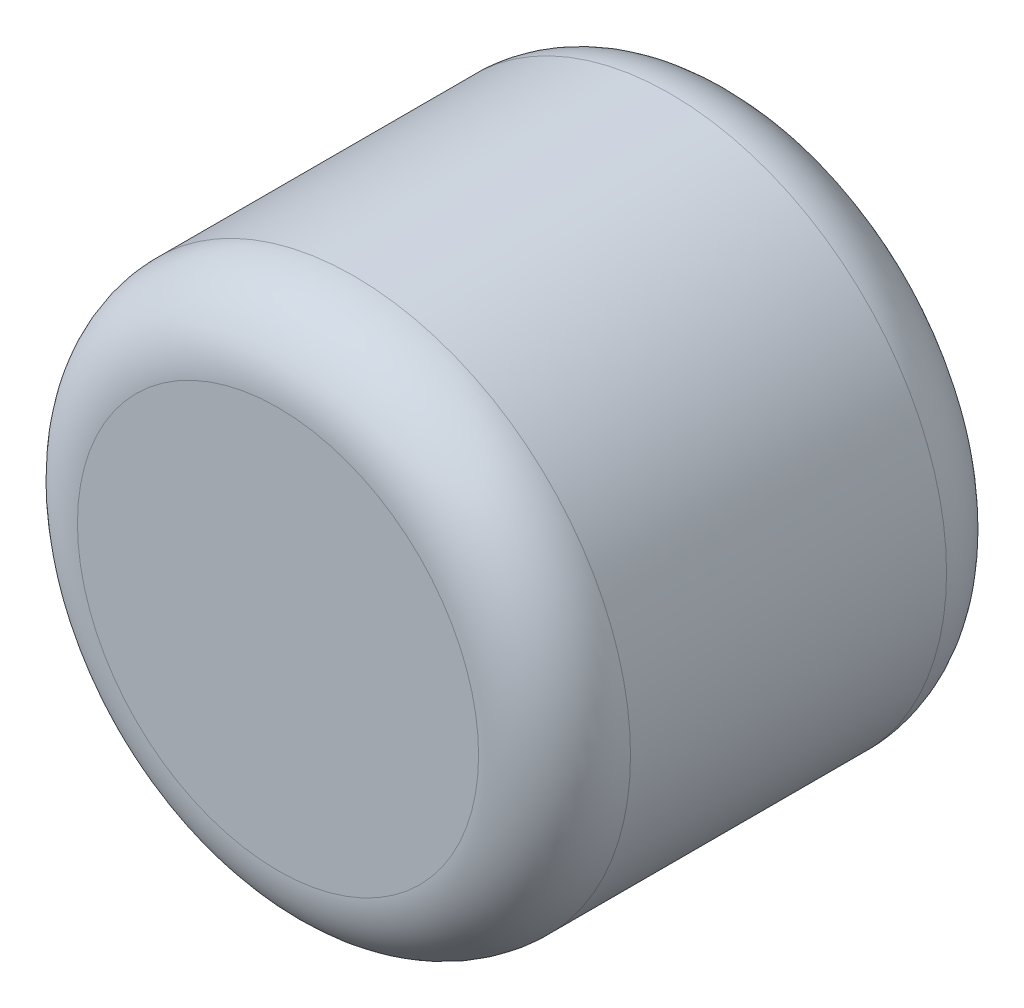
ISO-10303-21;
HEADER;
FILE_DESCRIPTION(('STEP AP214'),'2;1');
FILE_NAME('part.step','',(''),(''),'','','');
FILE_SCHEMA(('AUTOMOTIVE_DESIGN { 1 0 10303 214 1 1 1 1 }'));
ENDSEC;
DATA;
#1=APPLICATION_CONTEXT('core data for automotive mechanical design processes');
#2=APPLICATION_PROTOCOL_DEFINITION('international standard','automotive_design',2000,#1);
#3=PRODUCT_CONTEXT('',#1,'mechanical');
#4=PRODUCT('Part','Part','',(#3));
#5=PRODUCT_RELATED_PRODUCT_CATEGORY('part','',(#4));
#6=PRODUCT_DEFINITION_FORMATION('','',#4);
#7=PRODUCT_DEFINITION_CONTEXT('part definition',#1,'design');
#8=PRODUCT_DEFINITION('design','',#6,#7);
#9=PRODUCT_DEFINITION_SHAPE('','',#8);
#10=(LENGTH_UNIT() NAMED_UNIT(*) SI_UNIT(.MILLI.,.METRE.));
#11=(NAMED_UNIT(*) PLANE_ANGLE_UNIT() SI_UNIT($,.RADIAN.));
#12=(NAMED_UNIT(*) SI_UNIT($,.STERADIAN.) SOLID_ANGLE_UNIT());
#13=UNCERTAINTY_MEASURE_WITH_UNIT(LENGTH_MEASURE(1.E-05),#10,'distance_accuracy_value','');
#14=(GEOMETRIC_REPRESENTATION_CONTEXT(3) GLOBAL_UNCERTAINTY_ASSIGNED_CONTEXT((#13)) GLOBAL_UNIT_ASSIGNED_CONTEXT((#10,
#11,#12)) REPRESENTATION_CONTEXT('',''));
#15=CARTESIAN_POINT('',(0.,0.,0.));
#16=DIRECTION('',(0.,0.,1.));
#17=DIRECTION('',(1.,0.,0.));
#18=AXIS2_PLACEMENT_3D('',#15,#16,#17);
#19=CARTESIAN_POINT('',(0.,0.,7.8232));
#20=DIRECTION('',(0.,0.,-1.));
#21=DIRECTION('',(-1.,0.,0.));
#22=AXIS2_PLACEMENT_3D('',#19,#20,#21);
#23=CYLINDRICAL_SURFACE('',#22,4.6228);
#24=CARTESIAN_POINT('',(0.,0.,1.27));
#25=DIRECTION('',(0.,0.,1.));
#26=DIRECTION('',(1.,0.,0.));
#27=AXIS2_PLACEMENT_3D('',#24,#25,#26);
#28=CIRCLE('',#27,4.6228);
#29=CARTESIAN_POINT('',(4.6228,0.,1.27));
#30=VERTEX_POINT('',#29);
#31=EDGE_CURVE('E58',#30,#30,#28,.T.);
#32=ORIENTED_EDGE('',*,*,#31,.T.);
#33=EDGE_LOOP('',(#32));
#34=FACE_BOUND('',#33,.T.);
#35=CARTESIAN_POINT('',(0.,0.,6.5532));
#36=DIRECTION('',(0.,0.,1.));
#37=DIRECTION('',(1.,0.,0.));
#38=AXIS2_PLACEMENT_3D('',#35,#36,#37);
#39=CIRCLE('',#38,4.6228);
#40=CARTESIAN_POINT('',(4.6228,0.,6.5532));
#41=VERTEX_POINT('',#40);
#42=EDGE_CURVE('E63',#41,#41,#39,.F.);
#43=ORIENTED_EDGE('',*,*,#42,.T.);
#44=EDGE_LOOP('',(#43));
#45=FACE_BOUND('',#44,.T.);
#46=ADVANCED_FACE('F45',(#34,#45),#23,.T.);
#47=CARTESIAN_POINT('',(0.,0.,7.8232));
#48=DIRECTION('',(0.,0.,1.));
#49=DIRECTION('',(1.,0.,0.));
#50=AXIS2_PLACEMENT_3D('',#47,#48,#49);
#51=PLANE('',#50);
#52=CARTESIAN_POINT('',(0.,0.,7.8232));
#53=DIRECTION('',(0.,0.,1.));
#54=DIRECTION('',(1.,0.,0.));
#55=AXIS2_PLACEMENT_3D('',#52,#53,#54);
#56=CIRCLE('',#55,3.3528);
#57=CARTESIAN_POINT('',(3.3528,0.,7.8232));
#58=VERTEX_POINT('',#57);
#59=EDGE_CURVE('E10',#58,#58,#56,.T.);
#60=ORIENTED_EDGE('',*,*,#59,.T.);
#61=EDGE_LOOP('',(#60));
#62=FACE_BOUND('',#61,.T.);
#63=ADVANCED_FACE('F80',(#62),#51,.T.);
#64=CARTESIAN_POINT('',(0.,0.,0.));
#65=DIRECTION('',(0.,0.,1.));
#66=DIRECTION('',(1.,0.,0.));
#67=AXIS2_PLACEMENT_3D('',#64,#65,#66);
#68=PLANE('',#67);
#69=CARTESIAN_POINT('',(0.,0.,0.));
#70=DIRECTION('',(0.,0.,1.));
#71=DIRECTION('',(1.,0.,0.));
#72=AXIS2_PLACEMENT_3D('',#69,#70,#71);
#73=CIRCLE('',#72,3.3528);
#74=CARTESIAN_POINT('',(3.3528,0.,0.));
#75=VERTEX_POINT('',#74);
#76=EDGE_CURVE('E53',#75,#75,#73,.F.);
#77=ORIENTED_EDGE('',*,*,#76,.T.);
#78=EDGE_LOOP('',(#77));
#79=FACE_BOUND('',#78,.T.);
#80=ADVANCED_FACE('F77',(#79),#68,.F.);
#81=CARTESIAN_POINT('',(0.,0.,1.27));
#82=DIRECTION('',(0.,0.,1.));
#83=DIRECTION('',(1.,0.,0.));
#84=AXIS2_PLACEMENT_3D('',#81,#82,#83);
#85=TOROIDAL_SURFACE('',#84,3.3528,1.27);
#86=ORIENTED_EDGE('',*,*,#76,.F.);
#87=EDGE_LOOP('',(#86));
#88=FACE_BOUND('',#87,.T.);
#89=ORIENTED_EDGE('',*,*,#31,.F.);
#90=EDGE_LOOP('',(#89));
#91=FACE_BOUND('',#90,.T.);
#92=ADVANCED_FACE('F73',(#88,#91),#85,.T.);
#93=CARTESIAN_POINT('',(0.,0.,6.5532));
#94=DIRECTION('',(0.,0.,1.));
#95=DIRECTION('',(1.,0.,0.));
#96=AXIS2_PLACEMENT_3D('',#93,#94,#95);
#97=TOROIDAL_SURFACE('',#96,3.3528,1.27);
#98=ORIENTED_EDGE('',*,*,#42,.F.);
#99=EDGE_LOOP('',(#98));
#100=FACE_BOUND('',#99,.T.);
#101=ORIENTED_EDGE('',*,*,#59,.F.);
#102=EDGE_LOOP('',(#101));
#103=FACE_BOUND('',#102,.T.);
#104=ADVANCED_FACE('F47',(#100,#103),#97,.T.);
#105=CLOSED_SHELL('',(#46,#63,#80,#92,#104));
#106=MANIFOLD_SOLID_BREP('B2',#105);
#107=ADVANCED_BREP_SHAPE_REPRESENTATION('',(#18,#106),#14);
#108=SHAPE_DEFINITION_REPRESENTATION(#9,#107);
ENDSEC;
END-ISO-10303-21;
